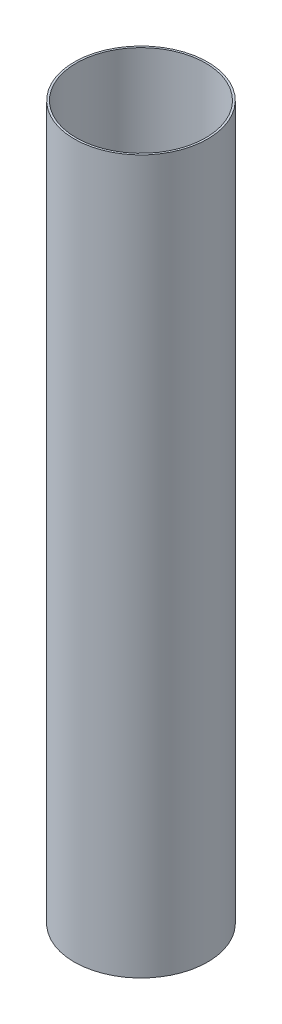
ISO-10303-21;
HEADER;
FILE_DESCRIPTION(('STEP AP214'),'2;1');
FILE_NAME('part.step','',(''),(''),'','','');
FILE_SCHEMA(('AUTOMOTIVE_DESIGN { 1 0 10303 214 1 1 1 1 }'));
ENDSEC;
DATA;
#1=APPLICATION_CONTEXT('core data for automotive mechanical design processes');
#2=APPLICATION_PROTOCOL_DEFINITION('international standard','automotive_design',2000,#1);
#3=PRODUCT_CONTEXT('',#1,'mechanical');
#4=PRODUCT('Part','Part','',(#3));
#5=PRODUCT_RELATED_PRODUCT_CATEGORY('part','',(#4));
#6=PRODUCT_DEFINITION_FORMATION('','',#4);
#7=PRODUCT_DEFINITION_CONTEXT('part definition',#1,'design');
#8=PRODUCT_DEFINITION('design','',#6,#7);
#9=PRODUCT_DEFINITION_SHAPE('','',#8);
#10=(LENGTH_UNIT() NAMED_UNIT(*) SI_UNIT(.MILLI.,.METRE.));
#11=(NAMED_UNIT(*) PLANE_ANGLE_UNIT() SI_UNIT($,.RADIAN.));
#12=(NAMED_UNIT(*) SI_UNIT($,.STERADIAN.) SOLID_ANGLE_UNIT());
#13=UNCERTAINTY_MEASURE_WITH_UNIT(LENGTH_MEASURE(1.E-05),#10,'distance_accuracy_value','');
#14=(GEOMETRIC_REPRESENTATION_CONTEXT(3) GLOBAL_UNCERTAINTY_ASSIGNED_CONTEXT((#13)) GLOBAL_UNIT_ASSIGNED_CONTEXT((#10,
#11,#12)) REPRESENTATION_CONTEXT('',''));
#15=CARTESIAN_POINT('',(0.,0.,0.));
#16=DIRECTION('',(0.,0.,1.));
#17=DIRECTION('',(1.,0.,0.));
#18=AXIS2_PLACEMENT_3D('',#15,#16,#17);
#19=CARTESIAN_POINT('',(0.,420.,0.));
#20=DIRECTION('',(0.,1.,0.));
#21=DIRECTION('',(0.,0.,1.));
#22=AXIS2_PLACEMENT_3D('',#19,#20,#21);
#23=PLANE('',#22);
#24=CARTESIAN_POINT('',(0.,420.,0.));
#25=DIRECTION('',(0.,1.,0.));
#26=DIRECTION('',(0.,0.,1.));
#27=AXIS2_PLACEMENT_3D('',#24,#25,#26);
#28=CIRCLE('',#27,39.3);
#29=CARTESIAN_POINT('',(0.,420.,39.3));
#30=VERTEX_POINT('',#29);
#31=EDGE_CURVE('E10',#30,#30,#28,.T.);
#32=ORIENTED_EDGE('',*,*,#31,.T.);
#33=EDGE_LOOP('',(#32));
#34=FACE_BOUND('',#33,.T.);
#35=CARTESIAN_POINT('',(0.,420.,0.));
#36=DIRECTION('',(0.,1.,0.));
#37=DIRECTION('',(0.,0.,1.));
#38=AXIS2_PLACEMENT_3D('',#35,#36,#37);
#39=CIRCLE('',#38,38.15);
#40=CARTESIAN_POINT('',(0.,420.,38.15));
#41=VERTEX_POINT('',#40);
#42=EDGE_CURVE('E54',#41,#41,#39,.T.);
#43=ORIENTED_EDGE('',*,*,#42,.F.);
#44=EDGE_LOOP('',(#43));
#45=FACE_BOUND('',#44,.T.);
#46=ADVANCED_FACE('F43',(#34,#45),#23,.T.);
#47=CARTESIAN_POINT('',(0.,0.,0.));
#48=DIRECTION('',(0.,1.,0.));
#49=DIRECTION('',(0.,0.,1.));
#50=AXIS2_PLACEMENT_3D('',#47,#48,#49);
#51=PLANE('',#50);
#52=CARTESIAN_POINT('',(0.,0.,0.));
#53=DIRECTION('',(0.,1.,0.));
#54=DIRECTION('',(0.,0.,1.));
#55=AXIS2_PLACEMENT_3D('',#52,#53,#54);
#56=CIRCLE('',#55,39.3);
#57=CARTESIAN_POINT('',(0.,0.,39.3));
#58=VERTEX_POINT('',#57);
#59=EDGE_CURVE('E47',#58,#58,#56,.T.);
#60=ORIENTED_EDGE('',*,*,#59,.F.);
#61=EDGE_LOOP('',(#60));
#62=FACE_BOUND('',#61,.T.);
#63=CARTESIAN_POINT('',(0.,0.,0.));
#64=DIRECTION('',(0.,1.,0.));
#65=DIRECTION('',(0.,0.,1.));
#66=AXIS2_PLACEMENT_3D('',#63,#64,#65);
#67=CIRCLE('',#66,38.15);
#68=CARTESIAN_POINT('',(0.,0.,38.15));
#69=VERTEX_POINT('',#68);
#70=EDGE_CURVE('E56',#69,#69,#67,.T.);
#71=ORIENTED_EDGE('',*,*,#70,.T.);
#72=EDGE_LOOP('',(#71));
#73=FACE_BOUND('',#72,.T.);
#74=ADVANCED_FACE('F66',(#62,#73),#51,.F.);
#75=CARTESIAN_POINT('',(0.,420.,0.));
#76=DIRECTION('',(0.,-1.,0.));
#77=DIRECTION('',(0.,0.,-1.));
#78=AXIS2_PLACEMENT_3D('',#75,#76,#77);
#79=CYLINDRICAL_SURFACE('',#78,39.3);
#80=ORIENTED_EDGE('',*,*,#31,.F.);
#81=EDGE_LOOP('',(#80));
#82=FACE_BOUND('',#81,.T.);
#83=ORIENTED_EDGE('',*,*,#59,.T.);
#84=EDGE_LOOP('',(#83));
#85=FACE_BOUND('',#84,.T.);
#86=ADVANCED_FACE('F45',(#82,#85),#79,.T.);
#87=CARTESIAN_POINT('',(0.,420.,0.));
#88=DIRECTION('',(0.,-1.,0.));
#89=DIRECTION('',(0.,0.,-1.));
#90=AXIS2_PLACEMENT_3D('',#87,#88,#89);
#91=CYLINDRICAL_SURFACE('',#90,38.15);
#92=ORIENTED_EDGE('',*,*,#42,.T.);
#93=EDGE_LOOP('',(#92));
#94=FACE_BOUND('',#93,.T.);
#95=ORIENTED_EDGE('',*,*,#70,.F.);
#96=EDGE_LOOP('',(#95));
#97=FACE_BOUND('',#96,.T.);
#98=ADVANCED_FACE('F62',(#94,#97),#91,.F.);
#99=CLOSED_SHELL('',(#46,#74,#86,#98));
#100=MANIFOLD_SOLID_BREP('B2',#99);
#101=ADVANCED_BREP_SHAPE_REPRESENTATION('',(#18,#100),#14);
#102=SHAPE_DEFINITION_REPRESENTATION(#9,#101);
ENDSEC;
END-ISO-10303-21;
